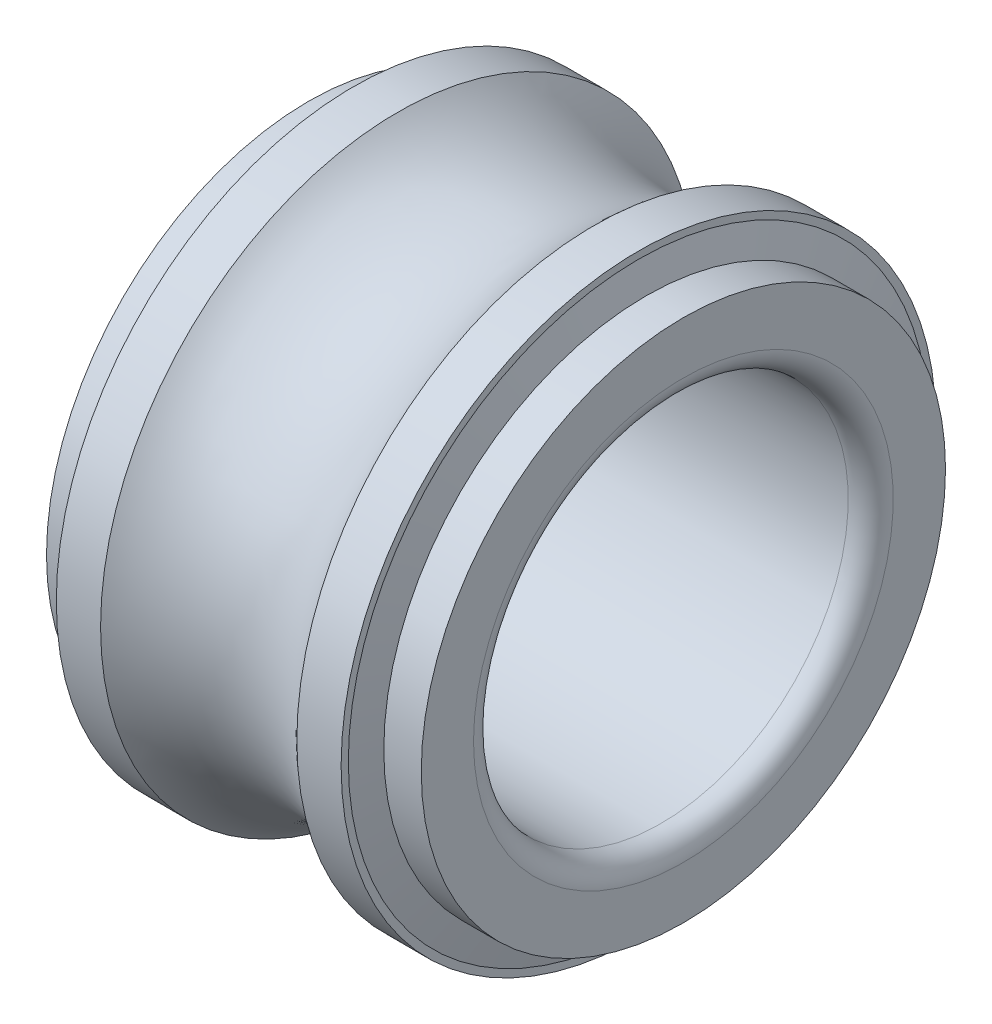
ISO-10303-21;
HEADER;
FILE_DESCRIPTION(('STEP AP214'),'2;1');
FILE_NAME('part.step','',(''),(''),'','','');
FILE_SCHEMA(('AUTOMOTIVE_DESIGN { 1 0 10303 214 1 1 1 1 }'));
ENDSEC;
DATA;
#1=APPLICATION_CONTEXT('core data for automotive mechanical design processes');
#2=APPLICATION_PROTOCOL_DEFINITION('international standard','automotive_design',2000,#1);
#3=PRODUCT_CONTEXT('',#1,'mechanical');
#4=PRODUCT('Part','Part','',(#3));
#5=PRODUCT_RELATED_PRODUCT_CATEGORY('part','',(#4));
#6=PRODUCT_DEFINITION_FORMATION('','',#4);
#7=PRODUCT_DEFINITION_CONTEXT('part definition',#1,'design');
#8=PRODUCT_DEFINITION('design','',#6,#7);
#9=PRODUCT_DEFINITION_SHAPE('','',#8);
#10=(LENGTH_UNIT() NAMED_UNIT(*) SI_UNIT(.MILLI.,.METRE.));
#11=(NAMED_UNIT(*) PLANE_ANGLE_UNIT() SI_UNIT($,.RADIAN.));
#12=(NAMED_UNIT(*) SI_UNIT($,.STERADIAN.) SOLID_ANGLE_UNIT());
#13=UNCERTAINTY_MEASURE_WITH_UNIT(LENGTH_MEASURE(1.E-05),#10,'distance_accuracy_value','');
#14=(GEOMETRIC_REPRESENTATION_CONTEXT(3) GLOBAL_UNCERTAINTY_ASSIGNED_CONTEXT((#13)) GLOBAL_UNIT_ASSIGNED_CONTEXT((#10,
#11,#12)) REPRESENTATION_CONTEXT('',''));
#15=CARTESIAN_POINT('',(0.,0.,0.));
#16=DIRECTION('',(0.,0.,1.));
#17=DIRECTION('',(1.,0.,0.));
#18=AXIS2_PLACEMENT_3D('',#15,#16,#17);
#19=CARTESIAN_POINT('',(0.3,0.,0.));
#20=DIRECTION('',(-1.,0.,0.));
#21=DIRECTION('',(0.,0.,1.));
#22=AXIS2_PLACEMENT_3D('',#19,#20,#21);
#23=CYLINDRICAL_SURFACE('',#22,3.96666666666666);
#24=CARTESIAN_POINT('',(3.80926187856619,0.,0.));
#25=DIRECTION('',(-1.,0.,0.));
#26=DIRECTION('',(0.,0.,1.));
#27=AXIS2_PLACEMENT_3D('',#24,#25,#26);
#28=CIRCLE('',#27,3.96666666666666);
#29=CARTESIAN_POINT('',(3.80926187856619,0.,3.96666666666666));
#30=VERTEX_POINT('',#29);
#31=EDGE_CURVE('E41',#30,#30,#28,.F.);
#32=ORIENTED_EDGE('',*,*,#31,.T.);
#33=EDGE_LOOP('',(#32));
#34=FACE_BOUND('',#33,.T.);
#35=CARTESIAN_POINT('',(4.4,0.,0.));
#36=DIRECTION('',(1.,0.,0.));
#37=DIRECTION('',(0.,0.,-1.));
#38=AXIS2_PLACEMENT_3D('',#35,#36,#37);
#39=CIRCLE('',#38,3.96666666666666);
#40=CARTESIAN_POINT('',(4.4,0.,-3.96666666666666));
#41=VERTEX_POINT('',#40);
#42=EDGE_CURVE('E18',#41,#41,#39,.T.);
#43=ORIENTED_EDGE('',*,*,#42,.F.);
#44=EDGE_LOOP('',(#43));
#45=FACE_BOUND('',#44,.T.);
#46=ADVANCED_FACE('F14',(#34,#45),#23,.T.);
#47=CARTESIAN_POINT('',(5.,2.8,0.));
#48=DIRECTION('',(-1.,0.,0.));
#49=DIRECTION('',(0.,0.,1.));
#50=AXIS2_PLACEMENT_3D('',#47,#48,#49);
#51=PLANE('',#50);
#52=CARTESIAN_POINT('',(5.,0.,0.));
#53=DIRECTION('',(-1.,0.,0.));
#54=DIRECTION('',(0.,0.,1.));
#55=AXIS2_PLACEMENT_3D('',#52,#53,#54);
#56=CIRCLE('',#55,2.8);
#57=CARTESIAN_POINT('',(5.,0.,2.8));
#58=VERTEX_POINT('',#57);
#59=EDGE_CURVE('E33',#58,#58,#56,.T.);
#60=ORIENTED_EDGE('',*,*,#59,.T.);
#61=EDGE_LOOP('',(#60));
#62=FACE_BOUND('',#61,.T.);
#63=CARTESIAN_POINT('',(5.,0.,0.));
#64=DIRECTION('',(-1.,0.,0.));
#65=DIRECTION('',(0.,0.,1.));
#66=AXIS2_PLACEMENT_3D('',#63,#64,#65);
#67=CIRCLE('',#66,3.49733333333333);
#68=CARTESIAN_POINT('',(5.,0.,3.49733333333334));
#69=VERTEX_POINT('',#68);
#70=EDGE_CURVE('E54',#69,#69,#67,.T.);
#71=ORIENTED_EDGE('',*,*,#70,.F.);
#72=EDGE_LOOP('',(#71));
#73=FACE_BOUND('',#72,.T.);
#74=ADVANCED_FACE('F92',(#62,#73),#51,.F.);
#75=CARTESIAN_POINT('',(1.19073812143381,0.,0.));
#76=DIRECTION('',(1.,0.,0.));
#77=DIRECTION('',(0.,0.,-1.));
#78=AXIS2_PLACEMENT_3D('',#75,#76,#77);
#79=CIRCLE('',#78,3.96666666666666);
#80=CARTESIAN_POINT('',(1.19073812143381,0.,-3.96666666666666));
#81=VERTEX_POINT('',#80);
#82=EDGE_CURVE('E37',#81,#81,#79,.F.);
#83=ORIENTED_EDGE('',*,*,#82,.T.);
#84=EDGE_LOOP('',(#83));
#85=FACE_BOUND('',#84,.T.);
#86=CARTESIAN_POINT('',(0.6,0.,0.));
#87=DIRECTION('',(-1.,0.,0.));
#88=DIRECTION('',(0.,0.,1.));
#89=AXIS2_PLACEMENT_3D('',#86,#87,#88);
#90=CIRCLE('',#89,3.96666666666666);
#91=CARTESIAN_POINT('',(0.6,0.,3.96666666666666));
#92=VERTEX_POINT('',#91);
#93=EDGE_CURVE('E42',#92,#92,#90,.T.);
#94=ORIENTED_EDGE('',*,*,#93,.F.);
#95=EDGE_LOOP('',(#94));
#96=FACE_BOUND('',#95,.T.);
#97=ADVANCED_FACE('F113',(#85,#96),#23,.T.);
#98=CARTESIAN_POINT('',(0.,2.8,0.));
#99=DIRECTION('',(-1.,0.,0.));
#100=DIRECTION('',(0.,0.,1.));
#101=AXIS2_PLACEMENT_3D('',#98,#99,#100);
#102=PLANE('',#101);
#103=CARTESIAN_POINT('',(0.,0.,0.));
#104=DIRECTION('',(-1.,0.,0.));
#105=DIRECTION('',(0.,0.,1.));
#106=AXIS2_PLACEMENT_3D('',#103,#104,#105);
#107=CIRCLE('',#106,2.8);
#108=CARTESIAN_POINT('',(0.,0.,2.8));
#109=VERTEX_POINT('',#108);
#110=EDGE_CURVE('E46',#109,#109,#107,.T.);
#111=ORIENTED_EDGE('',*,*,#110,.F.);
#112=EDGE_LOOP('',(#111));
#113=FACE_BOUND('',#112,.T.);
#114=CARTESIAN_POINT('',(0.,0.,0.));
#115=DIRECTION('',(-1.,0.,0.));
#116=DIRECTION('',(0.,0.,1.));
#117=AXIS2_PLACEMENT_3D('',#114,#115,#116);
#118=CIRCLE('',#117,3.49733333333333);
#119=CARTESIAN_POINT('',(0.,0.,3.49733333333333));
#120=VERTEX_POINT('',#119);
#121=EDGE_CURVE('E47',#120,#120,#118,.T.);
#122=ORIENTED_EDGE('',*,*,#121,.T.);
#123=EDGE_LOOP('',(#122));
#124=FACE_BOUND('',#123,.T.);
#125=ADVANCED_FACE('F108',(#113,#124),#102,.T.);
#126=CARTESIAN_POINT('',(0.3,0.,0.));
#127=DIRECTION('',(-1.,0.,0.));
#128=DIRECTION('',(0.,0.,1.));
#129=AXIS2_PLACEMENT_3D('',#126,#127,#128);
#130=TOROIDAL_SURFACE('',#129,2.8,0.3);
#131=CARTESIAN_POINT('',(0.3,0.,0.));
#132=DIRECTION('',(-1.,0.,0.));
#133=DIRECTION('',(0.,0.,1.));
#134=AXIS2_PLACEMENT_3D('',#131,#132,#133);
#135=CIRCLE('',#134,2.5);
#136=CARTESIAN_POINT('',(0.3,0.,2.5));
#137=VERTEX_POINT('',#136);
#138=EDGE_CURVE('E10',#137,#137,#135,.T.);
#139=ORIENTED_EDGE('',*,*,#138,.F.);
#140=EDGE_LOOP('',(#139));
#141=FACE_BOUND('',#140,.T.);
#142=ORIENTED_EDGE('',*,*,#110,.T.);
#143=EDGE_LOOP('',(#142));
#144=FACE_BOUND('',#143,.T.);
#145=ADVANCED_FACE('F16',(#141,#144),#130,.T.);
#146=CARTESIAN_POINT('',(0.3,0.,0.));
#147=DIRECTION('',(-1.,0.,0.));
#148=DIRECTION('',(0.,0.,1.));
#149=AXIS2_PLACEMENT_3D('',#146,#147,#148);
#150=CYLINDRICAL_SURFACE('',#149,2.5);
#151=CARTESIAN_POINT('',(4.7,0.,0.));
#152=DIRECTION('',(-1.,0.,0.));
#153=DIRECTION('',(0.,0.,1.));
#154=AXIS2_PLACEMENT_3D('',#151,#152,#153);
#155=CIRCLE('',#154,2.5);
#156=CARTESIAN_POINT('',(4.7,0.,2.5));
#157=VERTEX_POINT('',#156);
#158=EDGE_CURVE('E23',#157,#157,#155,.T.);
#159=ORIENTED_EDGE('',*,*,#158,.F.);
#160=EDGE_LOOP('',(#159));
#161=FACE_BOUND('',#160,.T.);
#162=ORIENTED_EDGE('',*,*,#138,.T.);
#163=EDGE_LOOP('',(#162));
#164=FACE_BOUND('',#163,.T.);
#165=ADVANCED_FACE('F99',(#161,#164),#150,.F.);
#166=CARTESIAN_POINT('',(4.7,0.,0.));
#167=DIRECTION('',(-1.,0.,0.));
#168=DIRECTION('',(0.,0.,1.));
#169=AXIS2_PLACEMENT_3D('',#166,#167,#168);
#170=TOROIDAL_SURFACE('',#169,2.8,0.3);
#171=ORIENTED_EDGE('',*,*,#59,.F.);
#172=EDGE_LOOP('',(#171));
#173=FACE_BOUND('',#172,.T.);
#174=ORIENTED_EDGE('',*,*,#158,.T.);
#175=EDGE_LOOP('',(#174));
#176=FACE_BOUND('',#175,.T.);
#177=ADVANCED_FACE('F95',(#173,#176),#170,.T.);
#178=CARTESIAN_POINT('',(2.5,0.,0.));
#179=DIRECTION('',(1.,0.,0.));
#180=DIRECTION('',(0.,-1.,0.));
#181=AXIS2_PLACEMENT_3D('',#178,#179,#180);
#182=TOROIDAL_SURFACE('',#181,5.25,1.83333333333333);
#183=ORIENTED_EDGE('',*,*,#82,.F.);
#184=EDGE_LOOP('',(#183));
#185=FACE_BOUND('',#184,.T.);
#186=ORIENTED_EDGE('',*,*,#31,.F.);
#187=EDGE_LOOP('',(#186));
#188=FACE_BOUND('',#187,.T.);
#189=ADVANCED_FACE('F98',(#185,#188),#182,.F.);
#190=CARTESIAN_POINT('',(0.6,3.87053841409022,0.));
#191=DIRECTION('',(-1.,0.,0.));
#192=DIRECTION('',(0.,0.,1.));
#193=AXIS2_PLACEMENT_3D('',#190,#191,#192);
#194=PLANE('',#193);
#195=CARTESIAN_POINT('',(0.6,0.,0.));
#196=DIRECTION('',(-1.,0.,0.));
#197=DIRECTION('',(0.,0.,1.));
#198=AXIS2_PLACEMENT_3D('',#195,#196,#197);
#199=CIRCLE('',#198,3.87053841409022);
#200=CARTESIAN_POINT('',(0.6,0.,3.87053841409022));
#201=VERTEX_POINT('',#200);
#202=EDGE_CURVE('E51',#201,#201,#199,.T.);
#203=ORIENTED_EDGE('',*,*,#202,.F.);
#204=EDGE_LOOP('',(#203));
#205=FACE_BOUND('',#204,.T.);
#206=ORIENTED_EDGE('',*,*,#93,.T.);
#207=EDGE_LOOP('',(#206));
#208=FACE_BOUND('',#207,.T.);
#209=ADVANCED_FACE('F130',(#205,#208),#194,.T.);
#210=CARTESIAN_POINT('',(0.5,0.,0.));
#211=DIRECTION('',(1.,0.,0.));
#212=DIRECTION('',(0.,0.,-1.));
#213=AXIS2_PLACEMENT_3D('',#210,#211,#212);
#214=CONICAL_SURFACE('',#213,3.49733333333333,1.30899693899575);
#215=ORIENTED_EDGE('',*,*,#202,.T.);
#216=EDGE_LOOP('',(#215));
#217=FACE_BOUND('',#216,.T.);
#218=CARTESIAN_POINT('',(0.5,0.,0.));
#219=DIRECTION('',(-1.,0.,0.));
#220=DIRECTION('',(0.,0.,1.));
#221=AXIS2_PLACEMENT_3D('',#218,#219,#220);
#222=CIRCLE('',#221,3.49733333333333);
#223=CARTESIAN_POINT('',(0.5,0.,3.49733333333333));
#224=VERTEX_POINT('',#223);
#225=EDGE_CURVE('E65',#224,#224,#222,.T.);
#226=ORIENTED_EDGE('',*,*,#225,.F.);
#227=EDGE_LOOP('',(#226));
#228=FACE_BOUND('',#227,.T.);
#229=ADVANCED_FACE('F132',(#217,#228),#214,.T.);
#230=CARTESIAN_POINT('',(-1.,0.,0.));
#231=DIRECTION('',(-1.,0.,0.));
#232=DIRECTION('',(0.,0.,1.));
#233=AXIS2_PLACEMENT_3D('',#230,#231,#232);
#234=CYLINDRICAL_SURFACE('',#233,3.49733333333333);
#235=ORIENTED_EDGE('',*,*,#121,.F.);
#236=EDGE_LOOP('',(#235));
#237=FACE_BOUND('',#236,.T.);
#238=ORIENTED_EDGE('',*,*,#225,.T.);
#239=EDGE_LOOP('',(#238));
#240=FACE_BOUND('',#239,.T.);
#241=ADVANCED_FACE('F139',(#237,#240),#234,.T.);
#242=CARTESIAN_POINT('',(4.4,3.87053841409022,0.));
#243=DIRECTION('',(1.,0.,0.));
#244=DIRECTION('',(0.,0.,-1.));
#245=AXIS2_PLACEMENT_3D('',#242,#243,#244);
#246=PLANE('',#245);
#247=CARTESIAN_POINT('',(4.4,0.,0.));
#248=DIRECTION('',(1.,0.,0.));
#249=DIRECTION('',(0.,0.,-1.));
#250=AXIS2_PLACEMENT_3D('',#247,#248,#249);
#251=CIRCLE('',#250,3.87053841409022);
#252=CARTESIAN_POINT('',(4.4,0.,-3.87053841409022));
#253=VERTEX_POINT('',#252);
#254=EDGE_CURVE('E57',#253,#253,#251,.T.);
#255=ORIENTED_EDGE('',*,*,#254,.F.);
#256=EDGE_LOOP('',(#255));
#257=FACE_BOUND('',#256,.T.);
#258=ORIENTED_EDGE('',*,*,#42,.T.);
#259=EDGE_LOOP('',(#258));
#260=FACE_BOUND('',#259,.T.);
#261=ADVANCED_FACE('F148',(#257,#260),#246,.T.);
#262=CARTESIAN_POINT('',(6.,0.,0.));
#263=DIRECTION('',(1.,0.,0.));
#264=DIRECTION('',(0.,0.,-1.));
#265=AXIS2_PLACEMENT_3D('',#262,#263,#264);
#266=CYLINDRICAL_SURFACE('',#265,3.49733333333333);
#267=CARTESIAN_POINT('',(4.5,0.,0.));
#268=DIRECTION('',(1.,0.,0.));
#269=DIRECTION('',(0.,0.,-1.));
#270=AXIS2_PLACEMENT_3D('',#267,#268,#269);
#271=CIRCLE('',#270,3.49733333333333);
#272=CARTESIAN_POINT('',(4.5,0.,-3.49733333333333));
#273=VERTEX_POINT('',#272);
#274=EDGE_CURVE('E68',#273,#273,#271,.T.);
#275=ORIENTED_EDGE('',*,*,#274,.T.);
#276=EDGE_LOOP('',(#275));
#277=FACE_BOUND('',#276,.T.);
#278=ORIENTED_EDGE('',*,*,#70,.T.);
#279=EDGE_LOOP('',(#278));
#280=FACE_BOUND('',#279,.T.);
#281=ADVANCED_FACE('F153',(#277,#280),#266,.T.);
#282=CARTESIAN_POINT('',(4.5,0.,0.));
#283=DIRECTION('',(-1.,0.,0.));
#284=DIRECTION('',(0.,0.,1.));
#285=AXIS2_PLACEMENT_3D('',#282,#283,#284);
#286=CONICAL_SURFACE('',#285,3.49733333333333,1.30899693899575);
#287=ORIENTED_EDGE('',*,*,#254,.T.);
#288=EDGE_LOOP('',(#287));
#289=FACE_BOUND('',#288,.T.);
#290=ORIENTED_EDGE('',*,*,#274,.F.);
#291=EDGE_LOOP('',(#290));
#292=FACE_BOUND('',#291,.T.);
#293=ADVANCED_FACE('F150',(#289,#292),#286,.T.);
#294=CLOSED_SHELL('',(#46,#74,#97,#125,#145,#165,#177,#189,#209,#229,#241,#261,#281,#293));
#295=MANIFOLD_SOLID_BREP('B1',#294);
#296=ADVANCED_BREP_SHAPE_REPRESENTATION('',(#18,#295),#14);
#297=SHAPE_DEFINITION_REPRESENTATION(#9,#296);
ENDSEC;
END-ISO-10303-21;
